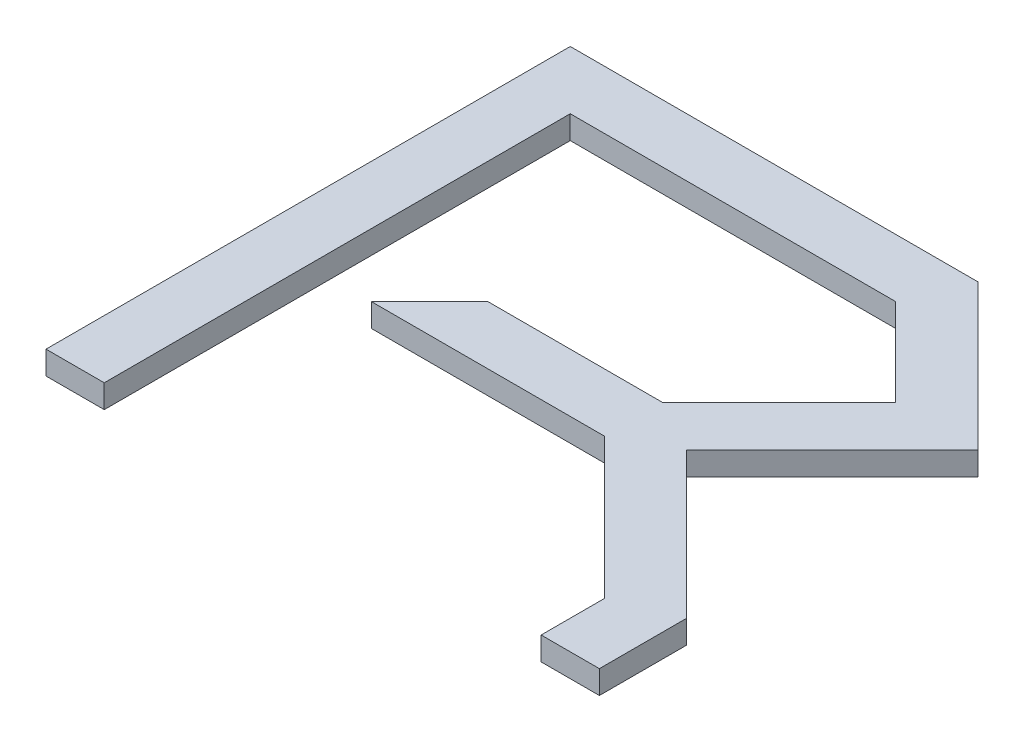
ISO-10303-21;
HEADER;
FILE_DESCRIPTION(('STEP AP214'),'2;1');
FILE_NAME('part.step','',(''),(''),'','','');
FILE_SCHEMA(('AUTOMOTIVE_DESIGN { 1 0 10303 214 1 1 1 1 }'));
ENDSEC;
DATA;
#1=APPLICATION_CONTEXT('core data for automotive mechanical design processes');
#2=APPLICATION_PROTOCOL_DEFINITION('international standard','automotive_design',2000,#1);
#3=PRODUCT_CONTEXT('',#1,'mechanical');
#4=PRODUCT('Part','Part','',(#3));
#5=PRODUCT_RELATED_PRODUCT_CATEGORY('part','',(#4));
#6=PRODUCT_DEFINITION_FORMATION('','',#4);
#7=PRODUCT_DEFINITION_CONTEXT('part definition',#1,'design');
#8=PRODUCT_DEFINITION('design','',#6,#7);
#9=PRODUCT_DEFINITION_SHAPE('','',#8);
#10=(LENGTH_UNIT() NAMED_UNIT(*) SI_UNIT(.MILLI.,.METRE.));
#11=(NAMED_UNIT(*) PLANE_ANGLE_UNIT() SI_UNIT($,.RADIAN.));
#12=(NAMED_UNIT(*) SI_UNIT($,.STERADIAN.) SOLID_ANGLE_UNIT());
#13=UNCERTAINTY_MEASURE_WITH_UNIT(LENGTH_MEASURE(1.E-05),#10,'distance_accuracy_value','');
#14=(GEOMETRIC_REPRESENTATION_CONTEXT(3) GLOBAL_UNCERTAINTY_ASSIGNED_CONTEXT((#13)) GLOBAL_UNIT_ASSIGNED_CONTEXT((#10,
#11,#12)) REPRESENTATION_CONTEXT('',''));
#15=CARTESIAN_POINT('',(0.,0.,0.));
#16=DIRECTION('',(0.,0.,1.));
#17=DIRECTION('',(1.,0.,0.));
#18=AXIS2_PLACEMENT_3D('',#15,#16,#17);
#19=CARTESIAN_POINT('',(-17.5,2.,-25.));
#20=DIRECTION('',(1.,0.,0.));
#21=DIRECTION('',(0.,0.,-1.));
#22=AXIS2_PLACEMENT_3D('',#19,#20,#21);
#23=PLANE('',#22);
#24=DIRECTION('',(0.,0.,1.));
#25=VECTOR('',#24,1.);
#26=CARTESIAN_POINT('',(-17.5,0.,-25.));
#27=LINE('',#26,#25);
#28=CARTESIAN_POINT('',(-17.5,0.,-25.));
#29=VERTEX_POINT('',#28);
#30=CARTESIAN_POINT('',(-17.5,0.,20.));
#31=VERTEX_POINT('',#30);
#32=EDGE_CURVE('E194',#29,#31,#27,.T.);
#33=ORIENTED_EDGE('',*,*,#32,.T.);
#34=DIRECTION('',(0.,-1.,0.));
#35=VECTOR('',#34,1.);
#36=CARTESIAN_POINT('',(-17.5,2.,20.));
#37=LINE('',#36,#35);
#38=CARTESIAN_POINT('',(-17.5,2.,20.));
#39=VERTEX_POINT('',#38);
#40=EDGE_CURVE('E11',#39,#31,#37,.T.);
#41=ORIENTED_EDGE('',*,*,#40,.F.);
#42=DIRECTION('',(0.,0.,1.));
#43=VECTOR('',#42,1.);
#44=CARTESIAN_POINT('',(-17.5,2.,-25.));
#45=LINE('',#44,#43);
#46=CARTESIAN_POINT('',(-17.5,2.,-25.));
#47=VERTEX_POINT('',#46);
#48=EDGE_CURVE('E243',#47,#39,#45,.T.);
#49=ORIENTED_EDGE('',*,*,#48,.F.);
#50=DIRECTION('',(0.,-1.,0.));
#51=VECTOR('',#50,1.);
#52=CARTESIAN_POINT('',(-17.5,2.,-25.));
#53=LINE('',#52,#51);
#54=EDGE_CURVE('E190',#47,#29,#53,.T.);
#55=ORIENTED_EDGE('',*,*,#54,.T.);
#56=EDGE_LOOP('',(#33,#41,#49,#55));
#57=FACE_BOUND('',#56,.T.);
#58=ADVANCED_FACE('F39',(#57),#23,.F.);
#59=CARTESIAN_POINT('',(-12.5,2.,20.));
#60=DIRECTION('',(0.,0.,-1.));
#61=DIRECTION('',(-1.,0.,0.));
#62=AXIS2_PLACEMENT_3D('',#59,#60,#61);
#63=PLANE('',#62);
#64=DIRECTION('',(1.,0.,0.));
#65=VECTOR('',#64,1.);
#66=CARTESIAN_POINT('',(-12.5,0.,20.));
#67=LINE('',#66,#65);
#68=CARTESIAN_POINT('',(-12.5,0.,20.));
#69=VERTEX_POINT('',#68);
#70=EDGE_CURVE('E198',#31,#69,#67,.T.);
#71=ORIENTED_EDGE('',*,*,#70,.T.);
#72=DIRECTION('',(0.,-1.,0.));
#73=VECTOR('',#72,1.);
#74=CARTESIAN_POINT('',(-12.5,2.,20.));
#75=LINE('',#74,#73);
#76=CARTESIAN_POINT('',(-12.5,2.,20.));
#77=VERTEX_POINT('',#76);
#78=EDGE_CURVE('E48',#77,#69,#75,.T.);
#79=ORIENTED_EDGE('',*,*,#78,.F.);
#80=DIRECTION('',(1.,0.,0.));
#81=VECTOR('',#80,1.);
#82=CARTESIAN_POINT('',(-12.5,2.,20.));
#83=LINE('',#82,#81);
#84=EDGE_CURVE('E126',#39,#77,#83,.T.);
#85=ORIENTED_EDGE('',*,*,#84,.F.);
#86=ORIENTED_EDGE('',*,*,#40,.T.);
#87=EDGE_LOOP('',(#71,#79,#85,#86));
#88=FACE_BOUND('',#87,.T.);
#89=ADVANCED_FACE('F372',(#88),#63,.F.);
#90=CARTESIAN_POINT('',(-12.5,2.,-20.));
#91=DIRECTION('',(-1.,0.,0.));
#92=DIRECTION('',(0.,0.,1.));
#93=AXIS2_PLACEMENT_3D('',#90,#91,#92);
#94=PLANE('',#93);
#95=DIRECTION('',(0.,0.,-1.));
#96=VECTOR('',#95,1.);
#97=CARTESIAN_POINT('',(-12.5,0.,-20.));
#98=LINE('',#97,#96);
#99=CARTESIAN_POINT('',(-12.5,0.,-20.));
#100=VERTEX_POINT('',#99);
#101=EDGE_CURVE('E201',#69,#100,#98,.T.);
#102=ORIENTED_EDGE('',*,*,#101,.T.);
#103=DIRECTION('',(0.,-1.,0.));
#104=VECTOR('',#103,1.);
#105=CARTESIAN_POINT('',(-12.5,2.,-20.));
#106=LINE('',#105,#104);
#107=CARTESIAN_POINT('',(-12.5,2.,-20.));
#108=VERTEX_POINT('',#107);
#109=EDGE_CURVE('E290',#108,#100,#106,.T.);
#110=ORIENTED_EDGE('',*,*,#109,.F.);
#111=DIRECTION('',(0.,0.,-1.));
#112=VECTOR('',#111,1.);
#113=CARTESIAN_POINT('',(-12.5,2.,-20.));
#114=LINE('',#113,#112);
#115=EDGE_CURVE('E300',#77,#108,#114,.T.);
#116=ORIENTED_EDGE('',*,*,#115,.F.);
#117=ORIENTED_EDGE('',*,*,#78,.T.);
#118=EDGE_LOOP('',(#102,#110,#116,#117));
#119=FACE_BOUND('',#118,.T.);
#120=ADVANCED_FACE('F298',(#119),#94,.F.);
#121=CARTESIAN_POINT('',(-12.5,2.,-20.));
#122=DIRECTION('',(0.,0.,-1.));
#123=DIRECTION('',(-1.,0.,0.));
#124=AXIS2_PLACEMENT_3D('',#121,#122,#123);
#125=PLANE('',#124);
#126=DIRECTION('',(1.,0.,0.));
#127=VECTOR('',#126,1.);
#128=CARTESIAN_POINT('',(-12.5,0.,-20.));
#129=LINE('',#128,#127);
#130=CARTESIAN_POINT('',(15.4289321881345,0.,-20.));
#131=VERTEX_POINT('',#130);
#132=EDGE_CURVE('E204',#100,#131,#129,.T.);
#133=ORIENTED_EDGE('',*,*,#132,.T.);
#134=DIRECTION('',(0.,-1.,0.));
#135=VECTOR('',#134,1.);
#136=CARTESIAN_POINT('',(15.4289321881345,2.,-20.));
#137=LINE('',#136,#135);
#138=CARTESIAN_POINT('',(15.4289321881345,2.,-20.));
#139=VERTEX_POINT('',#138);
#140=EDGE_CURVE('E286',#139,#131,#137,.T.);
#141=ORIENTED_EDGE('',*,*,#140,.F.);
#142=DIRECTION('',(1.,0.,0.));
#143=VECTOR('',#142,1.);
#144=CARTESIAN_POINT('',(-12.5,2.,-20.));
#145=LINE('',#144,#143);
#146=EDGE_CURVE('E319',#108,#139,#145,.T.);
#147=ORIENTED_EDGE('',*,*,#146,.F.);
#148=ORIENTED_EDGE('',*,*,#109,.T.);
#149=EDGE_LOOP('',(#133,#141,#147,#148));
#150=FACE_BOUND('',#149,.T.);
#151=ADVANCED_FACE('F309',(#150),#125,.F.);
#152=CARTESIAN_POINT('',(15.4289321881345,2.,-20.));
#153=DIRECTION('',(0.707106781186548,0.,-0.707106781186547));
#154=DIRECTION('',(-0.707106781186547,0.,-0.707106781186548));
#155=AXIS2_PLACEMENT_3D('',#152,#153,#154);
#156=PLANE('',#155);
#157=DIRECTION('',(0.707106781186547,0.,0.707106781186548));
#158=VECTOR('',#157,1.);
#159=CARTESIAN_POINT('',(15.4289321881345,0.,-20.));
#160=LINE('',#159,#158);
#161=CARTESIAN_POINT('',(22.9289321881345,0.,-12.5));
#162=VERTEX_POINT('',#161);
#163=EDGE_CURVE('E207',#131,#162,#160,.T.);
#164=ORIENTED_EDGE('',*,*,#163,.T.);
#165=DIRECTION('',(0.,-1.,0.));
#166=VECTOR('',#165,1.);
#167=CARTESIAN_POINT('',(22.9289321881345,2.,-12.5));
#168=LINE('',#167,#166);
#169=CARTESIAN_POINT('',(22.9289321881345,2.,-12.5));
#170=VERTEX_POINT('',#169);
#171=EDGE_CURVE('E282',#170,#162,#168,.T.);
#172=ORIENTED_EDGE('',*,*,#171,.F.);
#173=DIRECTION('',(0.707106781186547,0.,0.707106781186548));
#174=VECTOR('',#173,1.);
#175=CARTESIAN_POINT('',(15.4289321881345,2.,-20.));
#176=LINE('',#175,#174);
#177=EDGE_CURVE('E315',#139,#170,#176,.T.);
#178=ORIENTED_EDGE('',*,*,#177,.F.);
#179=ORIENTED_EDGE('',*,*,#140,.T.);
#180=EDGE_LOOP('',(#164,#172,#178,#179));
#181=FACE_BOUND('',#180,.T.);
#182=ADVANCED_FACE('F313',(#181),#156,.F.);
#183=CARTESIAN_POINT('',(22.9289321881345,2.,-12.5));
#184=DIRECTION('',(0.707106781186547,0.,0.707106781186548));
#185=DIRECTION('',(0.707106781186548,0.,-0.707106781186547));
#186=AXIS2_PLACEMENT_3D('',#183,#184,#185);
#187=PLANE('',#186);
#188=DIRECTION('',(-0.707106781186548,0.,0.707106781186547));
#189=VECTOR('',#188,1.);
#190=CARTESIAN_POINT('',(22.9289321881345,0.,-12.5));
#191=LINE('',#190,#189);
#192=CARTESIAN_POINT('',(12.9289321881345,0.,-2.5));
#193=VERTEX_POINT('',#192);
#194=EDGE_CURVE('E210',#162,#193,#191,.T.);
#195=ORIENTED_EDGE('',*,*,#194,.T.);
#196=DIRECTION('',(0.,-1.,0.));
#197=VECTOR('',#196,1.);
#198=CARTESIAN_POINT('',(12.9289321881345,2.,-2.5));
#199=LINE('',#198,#197);
#200=CARTESIAN_POINT('',(12.9289321881345,2.,-2.5));
#201=VERTEX_POINT('',#200);
#202=EDGE_CURVE('E278',#201,#193,#199,.T.);
#203=ORIENTED_EDGE('',*,*,#202,.F.);
#204=DIRECTION('',(-0.707106781186548,0.,0.707106781186547));
#205=VECTOR('',#204,1.);
#206=CARTESIAN_POINT('',(22.9289321881345,2.,-12.5));
#207=LINE('',#206,#205);
#208=EDGE_CURVE('E318',#170,#201,#207,.T.);
#209=ORIENTED_EDGE('',*,*,#208,.F.);
#210=ORIENTED_EDGE('',*,*,#171,.T.);
#211=EDGE_LOOP('',(#195,#203,#209,#210));
#212=FACE_BOUND('',#211,.T.);
#213=ADVANCED_FACE('F385',(#212),#187,.F.);
#214=CARTESIAN_POINT('',(12.9289321881345,2.,-2.5));
#215=DIRECTION('',(0.,0.,1.));
#216=DIRECTION('',(1.,0.,0.));
#217=AXIS2_PLACEMENT_3D('',#214,#215,#216);
#218=PLANE('',#217);
#219=DIRECTION('',(-1.,0.,0.));
#220=VECTOR('',#219,1.);
#221=CARTESIAN_POINT('',(12.9289321881345,0.,-2.5));
#222=LINE('',#221,#220);
#223=CARTESIAN_POINT('',(-2.07106781186548,0.,-2.49999999999999));
#224=VERTEX_POINT('',#223);
#225=EDGE_CURVE('E213',#193,#224,#222,.T.);
#226=ORIENTED_EDGE('',*,*,#225,.T.);
#227=DIRECTION('',(0.,-1.,0.));
#228=VECTOR('',#227,1.);
#229=CARTESIAN_POINT('',(-2.07106781186548,2.,-2.49999999999999));
#230=LINE('',#229,#228);
#231=CARTESIAN_POINT('',(-2.07106781186548,2.,-2.49999999999999));
#232=VERTEX_POINT('',#231);
#233=EDGE_CURVE('E274',#232,#224,#230,.T.);
#234=ORIENTED_EDGE('',*,*,#233,.F.);
#235=DIRECTION('',(-1.,0.,0.));
#236=VECTOR('',#235,1.);
#237=CARTESIAN_POINT('',(12.9289321881345,2.,-2.5));
#238=LINE('',#237,#236);
#239=EDGE_CURVE('E323',#201,#232,#238,.T.);
#240=ORIENTED_EDGE('',*,*,#239,.F.);
#241=ORIENTED_EDGE('',*,*,#202,.T.);
#242=EDGE_LOOP('',(#226,#234,#240,#241));
#243=FACE_BOUND('',#242,.T.);
#244=ADVANCED_FACE('F388',(#243),#218,.F.);
#245=CARTESIAN_POINT('',(-7.07106781186548,2.,2.50000000000001));
#246=DIRECTION('',(0.707106781186547,0.,0.707106781186547));
#247=DIRECTION('',(0.707106781186548,0.,-0.707106781186548));
#248=AXIS2_PLACEMENT_3D('',#245,#246,#247);
#249=PLANE('',#248);
#250=DIRECTION('',(-0.707106781186548,0.,0.707106781186548));
#251=VECTOR('',#250,1.);
#252=CARTESIAN_POINT('',(-7.07106781186548,0.,2.50000000000001));
#253=LINE('',#252,#251);
#254=CARTESIAN_POINT('',(-7.07106781186548,0.,2.50000000000001));
#255=VERTEX_POINT('',#254);
#256=EDGE_CURVE('E216',#224,#255,#253,.T.);
#257=ORIENTED_EDGE('',*,*,#256,.T.);
#258=DIRECTION('',(0.,-1.,0.));
#259=VECTOR('',#258,1.);
#260=CARTESIAN_POINT('',(-7.07106781186548,2.,2.50000000000001));
#261=LINE('',#260,#259);
#262=CARTESIAN_POINT('',(-7.07106781186548,2.,2.50000000000001));
#263=VERTEX_POINT('',#262);
#264=EDGE_CURVE('E270',#263,#255,#261,.T.);
#265=ORIENTED_EDGE('',*,*,#264,.F.);
#266=DIRECTION('',(-0.707106781186548,0.,0.707106781186548));
#267=VECTOR('',#266,1.);
#268=CARTESIAN_POINT('',(-7.07106781186548,2.,2.50000000000001));
#269=LINE('',#268,#267);
#270=EDGE_CURVE('E330',#232,#263,#269,.T.);
#271=ORIENTED_EDGE('',*,*,#270,.F.);
#272=ORIENTED_EDGE('',*,*,#233,.T.);
#273=EDGE_LOOP('',(#257,#265,#271,#272));
#274=FACE_BOUND('',#273,.T.);
#275=ADVANCED_FACE('F392',(#274),#249,.F.);
#276=CARTESIAN_POINT('',(12.9289321881345,2.,2.50000000000001));
#277=DIRECTION('',(0.,0.,-1.));
#278=DIRECTION('',(-1.,0.,0.));
#279=AXIS2_PLACEMENT_3D('',#276,#277,#278);
#280=PLANE('',#279);
#281=DIRECTION('',(1.,0.,0.));
#282=VECTOR('',#281,1.);
#283=CARTESIAN_POINT('',(12.9289321881345,0.,2.50000000000001));
#284=LINE('',#283,#282);
#285=CARTESIAN_POINT('',(12.9289321881345,0.,2.50000000000001));
#286=VERTEX_POINT('',#285);
#287=EDGE_CURVE('E219',#255,#286,#284,.T.);
#288=ORIENTED_EDGE('',*,*,#287,.T.);
#289=DIRECTION('',(0.,-1.,0.));
#290=VECTOR('',#289,1.);
#291=CARTESIAN_POINT('',(12.9289321881345,2.,2.50000000000001));
#292=LINE('',#291,#290);
#293=CARTESIAN_POINT('',(12.9289321881345,2.,2.50000000000001));
#294=VERTEX_POINT('',#293);
#295=EDGE_CURVE('E266',#294,#286,#292,.T.);
#296=ORIENTED_EDGE('',*,*,#295,.F.);
#297=DIRECTION('',(1.,0.,0.));
#298=VECTOR('',#297,1.);
#299=CARTESIAN_POINT('',(12.9289321881345,2.,2.50000000000001));
#300=LINE('',#299,#298);
#301=EDGE_CURVE('E333',#263,#294,#300,.T.);
#302=ORIENTED_EDGE('',*,*,#301,.F.);
#303=ORIENTED_EDGE('',*,*,#264,.T.);
#304=EDGE_LOOP('',(#288,#296,#302,#303));
#305=FACE_BOUND('',#304,.T.);
#306=ADVANCED_FACE('F396',(#305),#280,.F.);
#307=CARTESIAN_POINT('',(12.9289321881345,2.,2.50000000000001));
#308=DIRECTION('',(0.707106781186548,0.,-0.707106781186547));
#309=DIRECTION('',(-0.707106781186547,0.,-0.707106781186548));
#310=AXIS2_PLACEMENT_3D('',#307,#308,#309);
#311=PLANE('',#310);
#312=DIRECTION('',(0.707106781186547,0.,0.707106781186548));
#313=VECTOR('',#312,1.);
#314=CARTESIAN_POINT('',(12.9289321881345,0.,2.50000000000001));
#315=LINE('',#314,#313);
#316=CARTESIAN_POINT('',(25.,0.,14.5710678118655));
#317=VERTEX_POINT('',#316);
#318=EDGE_CURVE('E222',#286,#317,#315,.T.);
#319=ORIENTED_EDGE('',*,*,#318,.T.);
#320=DIRECTION('',(0.,-1.,0.));
#321=VECTOR('',#320,1.);
#322=CARTESIAN_POINT('',(25.,2.,14.5710678118655));
#323=LINE('',#322,#321);
#324=CARTESIAN_POINT('',(25.,2.,14.5710678118655));
#325=VERTEX_POINT('',#324);
#326=EDGE_CURVE('E262',#325,#317,#323,.T.);
#327=ORIENTED_EDGE('',*,*,#326,.F.);
#328=DIRECTION('',(0.707106781186547,0.,0.707106781186548));
#329=VECTOR('',#328,1.);
#330=CARTESIAN_POINT('',(12.9289321881345,2.,2.50000000000001));
#331=LINE('',#330,#329);
#332=EDGE_CURVE('E336',#294,#325,#331,.T.);
#333=ORIENTED_EDGE('',*,*,#332,.F.);
#334=ORIENTED_EDGE('',*,*,#295,.T.);
#335=EDGE_LOOP('',(#319,#327,#333,#334));
#336=FACE_BOUND('',#335,.T.);
#337=ADVANCED_FACE('F400',(#336),#311,.F.);
#338=CARTESIAN_POINT('',(25.,2.,14.5710678118655));
#339=DIRECTION('',(1.,0.,0.));
#340=DIRECTION('',(0.,0.,-1.));
#341=AXIS2_PLACEMENT_3D('',#338,#339,#340);
#342=PLANE('',#341);
#343=DIRECTION('',(0.,0.,1.));
#344=VECTOR('',#343,1.);
#345=CARTESIAN_POINT('',(25.,0.,14.5710678118655));
#346=LINE('',#345,#344);
#347=CARTESIAN_POINT('',(25.,0.,20.));
#348=VERTEX_POINT('',#347);
#349=EDGE_CURVE('E225',#317,#348,#346,.T.);
#350=ORIENTED_EDGE('',*,*,#349,.T.);
#351=DIRECTION('',(0.,-1.,0.));
#352=VECTOR('',#351,1.);
#353=CARTESIAN_POINT('',(25.,2.,20.));
#354=LINE('',#353,#352);
#355=CARTESIAN_POINT('',(25.,2.,20.));
#356=VERTEX_POINT('',#355);
#357=EDGE_CURVE('E258',#356,#348,#354,.T.);
#358=ORIENTED_EDGE('',*,*,#357,.F.);
#359=DIRECTION('',(0.,0.,1.));
#360=VECTOR('',#359,1.);
#361=CARTESIAN_POINT('',(25.,2.,14.5710678118655));
#362=LINE('',#361,#360);
#363=EDGE_CURVE('E339',#325,#356,#362,.T.);
#364=ORIENTED_EDGE('',*,*,#363,.F.);
#365=ORIENTED_EDGE('',*,*,#326,.T.);
#366=EDGE_LOOP('',(#350,#358,#364,#365));
#367=FACE_BOUND('',#366,.T.);
#368=ADVANCED_FACE('F404',(#367),#342,.F.);
#369=CARTESIAN_POINT('',(25.,2.,20.));
#370=DIRECTION('',(0.,0.,-1.));
#371=DIRECTION('',(-1.,0.,0.));
#372=AXIS2_PLACEMENT_3D('',#369,#370,#371);
#373=PLANE('',#372);
#374=DIRECTION('',(1.,0.,0.));
#375=VECTOR('',#374,1.);
#376=CARTESIAN_POINT('',(25.,0.,20.));
#377=LINE('',#376,#375);
#378=CARTESIAN_POINT('',(30.,0.,20.));
#379=VERTEX_POINT('',#378);
#380=EDGE_CURVE('E228',#348,#379,#377,.T.);
#381=ORIENTED_EDGE('',*,*,#380,.T.);
#382=DIRECTION('',(0.,-1.,0.));
#383=VECTOR('',#382,1.);
#384=CARTESIAN_POINT('',(30.,2.,20.));
#385=LINE('',#384,#383);
#386=CARTESIAN_POINT('',(30.,2.,20.));
#387=VERTEX_POINT('',#386);
#388=EDGE_CURVE('E254',#387,#379,#385,.T.);
#389=ORIENTED_EDGE('',*,*,#388,.F.);
#390=DIRECTION('',(1.,0.,0.));
#391=VECTOR('',#390,1.);
#392=CARTESIAN_POINT('',(25.,2.,20.));
#393=LINE('',#392,#391);
#394=EDGE_CURVE('E342',#356,#387,#393,.T.);
#395=ORIENTED_EDGE('',*,*,#394,.F.);
#396=ORIENTED_EDGE('',*,*,#357,.T.);
#397=EDGE_LOOP('',(#381,#389,#395,#396));
#398=FACE_BOUND('',#397,.T.);
#399=ADVANCED_FACE('F408',(#398),#373,.F.);
#400=CARTESIAN_POINT('',(30.,2.,12.5));
#401=DIRECTION('',(-1.,0.,0.));
#402=DIRECTION('',(0.,0.,1.));
#403=AXIS2_PLACEMENT_3D('',#400,#401,#402);
#404=PLANE('',#403);
#405=DIRECTION('',(0.,0.,-1.));
#406=VECTOR('',#405,1.);
#407=CARTESIAN_POINT('',(30.,0.,12.5));
#408=LINE('',#407,#406);
#409=CARTESIAN_POINT('',(30.,0.,12.5));
#410=VERTEX_POINT('',#409);
#411=EDGE_CURVE('E231',#379,#410,#408,.T.);
#412=ORIENTED_EDGE('',*,*,#411,.T.);
#413=DIRECTION('',(0.,-1.,0.));
#414=VECTOR('',#413,1.);
#415=CARTESIAN_POINT('',(30.,2.,12.5));
#416=LINE('',#415,#414);
#417=CARTESIAN_POINT('',(30.,2.,12.5));
#418=VERTEX_POINT('',#417);
#419=EDGE_CURVE('E250',#418,#410,#416,.T.);
#420=ORIENTED_EDGE('',*,*,#419,.F.);
#421=DIRECTION('',(0.,0.,-1.));
#422=VECTOR('',#421,1.);
#423=CARTESIAN_POINT('',(30.,2.,12.5));
#424=LINE('',#423,#422);
#425=EDGE_CURVE('E345',#387,#418,#424,.T.);
#426=ORIENTED_EDGE('',*,*,#425,.F.);
#427=ORIENTED_EDGE('',*,*,#388,.T.);
#428=EDGE_LOOP('',(#412,#420,#426,#427));
#429=FACE_BOUND('',#428,.T.);
#430=ADVANCED_FACE('F353',(#429),#404,.F.);
#431=CARTESIAN_POINT('',(17.5,2.,0.));
#432=DIRECTION('',(-0.707106781186547,0.,0.707106781186548));
#433=DIRECTION('',(0.707106781186548,0.,0.707106781186547));
#434=AXIS2_PLACEMENT_3D('',#431,#432,#433);
#435=PLANE('',#434);
#436=DIRECTION('',(-0.707106781186548,0.,-0.707106781186547));
#437=VECTOR('',#436,1.);
#438=CARTESIAN_POINT('',(17.5,0.,0.));
#439=LINE('',#438,#437);
#440=CARTESIAN_POINT('',(17.5,0.,0.));
#441=VERTEX_POINT('',#440);
#442=EDGE_CURVE('E234',#410,#441,#439,.T.);
#443=ORIENTED_EDGE('',*,*,#442,.T.);
#444=DIRECTION('',(0.,-1.,0.));
#445=VECTOR('',#444,1.);
#446=CARTESIAN_POINT('',(17.5,2.,0.));
#447=LINE('',#446,#445);
#448=CARTESIAN_POINT('',(17.5,2.,0.));
#449=VERTEX_POINT('',#448);
#450=EDGE_CURVE('E183',#449,#441,#447,.T.);
#451=ORIENTED_EDGE('',*,*,#450,.F.);
#452=DIRECTION('',(-0.707106781186548,0.,-0.707106781186547));
#453=VECTOR('',#452,1.);
#454=CARTESIAN_POINT('',(17.5,2.,0.));
#455=LINE('',#454,#453);
#456=EDGE_CURVE('E172',#418,#449,#455,.T.);
#457=ORIENTED_EDGE('',*,*,#456,.F.);
#458=ORIENTED_EDGE('',*,*,#419,.T.);
#459=EDGE_LOOP('',(#443,#451,#457,#458));
#460=FACE_BOUND('',#459,.T.);
#461=ADVANCED_FACE('F357',(#460),#435,.F.);
#462=CARTESIAN_POINT('',(30.,2.,-12.5));
#463=DIRECTION('',(-0.707106781186547,0.,-0.707106781186547));
#464=DIRECTION('',(-0.707106781186548,0.,0.707106781186548));
#465=AXIS2_PLACEMENT_3D('',#462,#463,#464);
#466=PLANE('',#465);
#467=DIRECTION('',(0.707106781186548,0.,-0.707106781186548));
#468=VECTOR('',#467,1.);
#469=CARTESIAN_POINT('',(30.,0.,-12.5));
#470=LINE('',#469,#468);
#471=CARTESIAN_POINT('',(30.,0.,-12.5));
#472=VERTEX_POINT('',#471);
#473=EDGE_CURVE('E181',#441,#472,#470,.T.);
#474=ORIENTED_EDGE('',*,*,#473,.T.);
#475=DIRECTION('',(0.,-1.,0.));
#476=VECTOR('',#475,1.);
#477=CARTESIAN_POINT('',(30.,2.,-12.5));
#478=LINE('',#477,#476);
#479=CARTESIAN_POINT('',(30.,2.,-12.5));
#480=VERTEX_POINT('',#479);
#481=EDGE_CURVE('E178',#480,#472,#478,.T.);
#482=ORIENTED_EDGE('',*,*,#481,.F.);
#483=DIRECTION('',(0.707106781186548,0.,-0.707106781186548));
#484=VECTOR('',#483,1.);
#485=CARTESIAN_POINT('',(30.,2.,-12.5));
#486=LINE('',#485,#484);
#487=EDGE_CURVE('E166',#449,#480,#486,.T.);
#488=ORIENTED_EDGE('',*,*,#487,.F.);
#489=ORIENTED_EDGE('',*,*,#450,.T.);
#490=EDGE_LOOP('',(#474,#482,#488,#489));
#491=FACE_BOUND('',#490,.T.);
#492=ADVANCED_FACE('F179',(#491),#466,.F.);
#493=CARTESIAN_POINT('',(17.5,2.,-25.));
#494=DIRECTION('',(-0.707106781186547,0.,0.707106781186548));
#495=DIRECTION('',(0.707106781186548,0.,0.707106781186547));
#496=AXIS2_PLACEMENT_3D('',#493,#494,#495);
#497=PLANE('',#496);
#498=DIRECTION('',(-0.707106781186548,0.,-0.707106781186547));
#499=VECTOR('',#498,1.);
#500=CARTESIAN_POINT('',(17.5,0.,-25.));
#501=LINE('',#500,#499);
#502=CARTESIAN_POINT('',(17.5,0.,-25.));
#503=VERTEX_POINT('',#502);
#504=EDGE_CURVE('E112',#472,#503,#501,.T.);
#505=ORIENTED_EDGE('',*,*,#504,.T.);
#506=DIRECTION('',(0.,-1.,0.));
#507=VECTOR('',#506,1.);
#508=CARTESIAN_POINT('',(17.5,2.,-25.));
#509=LINE('',#508,#507);
#510=CARTESIAN_POINT('',(17.5,2.,-25.));
#511=VERTEX_POINT('',#510);
#512=EDGE_CURVE('E184',#511,#503,#509,.T.);
#513=ORIENTED_EDGE('',*,*,#512,.F.);
#514=DIRECTION('',(-0.707106781186548,0.,-0.707106781186547));
#515=VECTOR('',#514,1.);
#516=CARTESIAN_POINT('',(17.5,2.,-25.));
#517=LINE('',#516,#515);
#518=EDGE_CURVE('E170',#480,#511,#517,.T.);
#519=ORIENTED_EDGE('',*,*,#518,.F.);
#520=ORIENTED_EDGE('',*,*,#481,.T.);
#521=EDGE_LOOP('',(#505,#513,#519,#520));
#522=FACE_BOUND('',#521,.T.);
#523=ADVANCED_FACE('F186',(#522),#497,.F.);
#524=CARTESIAN_POINT('',(-17.5,2.,-25.));
#525=DIRECTION('',(0.,0.,1.));
#526=DIRECTION('',(1.,0.,0.));
#527=AXIS2_PLACEMENT_3D('',#524,#525,#526);
#528=PLANE('',#527);
#529=DIRECTION('',(-1.,0.,0.));
#530=VECTOR('',#529,1.);
#531=CARTESIAN_POINT('',(-17.5,0.,-25.));
#532=LINE('',#531,#530);
#533=EDGE_CURVE('E118',#503,#29,#532,.T.);
#534=ORIENTED_EDGE('',*,*,#533,.T.);
#535=ORIENTED_EDGE('',*,*,#54,.F.);
#536=DIRECTION('',(-1.,0.,0.));
#537=VECTOR('',#536,1.);
#538=CARTESIAN_POINT('',(-17.5,2.,-25.));
#539=LINE('',#538,#537);
#540=EDGE_CURVE('E56',#511,#47,#539,.T.);
#541=ORIENTED_EDGE('',*,*,#540,.F.);
#542=ORIENTED_EDGE('',*,*,#512,.T.);
#543=EDGE_LOOP('',(#534,#535,#541,#542));
#544=FACE_BOUND('',#543,.T.);
#545=ADVANCED_FACE('F361',(#544),#528,.F.);
#546=CARTESIAN_POINT('',(0.,2.,0.));
#547=DIRECTION('',(0.,-1.,0.));
#548=DIRECTION('',(0.,0.,-1.));
#549=AXIS2_PLACEMENT_3D('',#546,#547,#548);
#550=PLANE('',#549);
#551=ORIENTED_EDGE('',*,*,#48,.T.);
#552=ORIENTED_EDGE('',*,*,#84,.T.);
#553=ORIENTED_EDGE('',*,*,#115,.T.);
#554=ORIENTED_EDGE('',*,*,#146,.T.);
#555=ORIENTED_EDGE('',*,*,#177,.T.);
#556=ORIENTED_EDGE('',*,*,#208,.T.);
#557=ORIENTED_EDGE('',*,*,#239,.T.);
#558=ORIENTED_EDGE('',*,*,#270,.T.);
#559=ORIENTED_EDGE('',*,*,#301,.T.);
#560=ORIENTED_EDGE('',*,*,#332,.T.);
#561=ORIENTED_EDGE('',*,*,#363,.T.);
#562=ORIENTED_EDGE('',*,*,#394,.T.);
#563=ORIENTED_EDGE('',*,*,#425,.T.);
#564=ORIENTED_EDGE('',*,*,#456,.T.);
#565=ORIENTED_EDGE('',*,*,#487,.T.);
#566=ORIENTED_EDGE('',*,*,#518,.T.);
#567=ORIENTED_EDGE('',*,*,#540,.T.);
#568=EDGE_LOOP('',(#551,#552,#553,#554,#555,#556,#557,#558,#559,#560,#561,#562,#563,#564,#565,
#566,#567));
#569=FACE_BOUND('',#568,.T.);
#570=ADVANCED_FACE('F168',(#569),#550,.F.);
#571=CARTESIAN_POINT('',(0.,0.,0.));
#572=DIRECTION('',(0.,-1.,0.));
#573=DIRECTION('',(0.,0.,-1.));
#574=AXIS2_PLACEMENT_3D('',#571,#572,#573);
#575=PLANE('',#574);
#576=ORIENTED_EDGE('',*,*,#32,.F.);
#577=ORIENTED_EDGE('',*,*,#533,.F.);
#578=ORIENTED_EDGE('',*,*,#504,.F.);
#579=ORIENTED_EDGE('',*,*,#473,.F.);
#580=ORIENTED_EDGE('',*,*,#442,.F.);
#581=ORIENTED_EDGE('',*,*,#411,.F.);
#582=ORIENTED_EDGE('',*,*,#380,.F.);
#583=ORIENTED_EDGE('',*,*,#349,.F.);
#584=ORIENTED_EDGE('',*,*,#318,.F.);
#585=ORIENTED_EDGE('',*,*,#287,.F.);
#586=ORIENTED_EDGE('',*,*,#256,.F.);
#587=ORIENTED_EDGE('',*,*,#225,.F.);
#588=ORIENTED_EDGE('',*,*,#194,.F.);
#589=ORIENTED_EDGE('',*,*,#163,.F.);
#590=ORIENTED_EDGE('',*,*,#132,.F.);
#591=ORIENTED_EDGE('',*,*,#101,.F.);
#592=ORIENTED_EDGE('',*,*,#70,.F.);
#593=EDGE_LOOP('',(#576,#577,#578,#579,#580,#581,#582,#583,#584,#585,#586,#587,#588,#589,#590,
#591,#592));
#594=FACE_BOUND('',#593,.T.);
#595=ADVANCED_FACE('F304',(#594),#575,.T.);
#596=CLOSED_SHELL('',(#58,#89,#120,#151,#182,#213,#244,#275,#306,#337,#368,#399,#430,#461,#492,
#523,#545,#570,#595));
#597=MANIFOLD_SOLID_BREP('B2',#596);
#598=ADVANCED_BREP_SHAPE_REPRESENTATION('',(#18,#597),#14);
#599=SHAPE_DEFINITION_REPRESENTATION(#9,#598);
ENDSEC;
END-ISO-10303-21;
